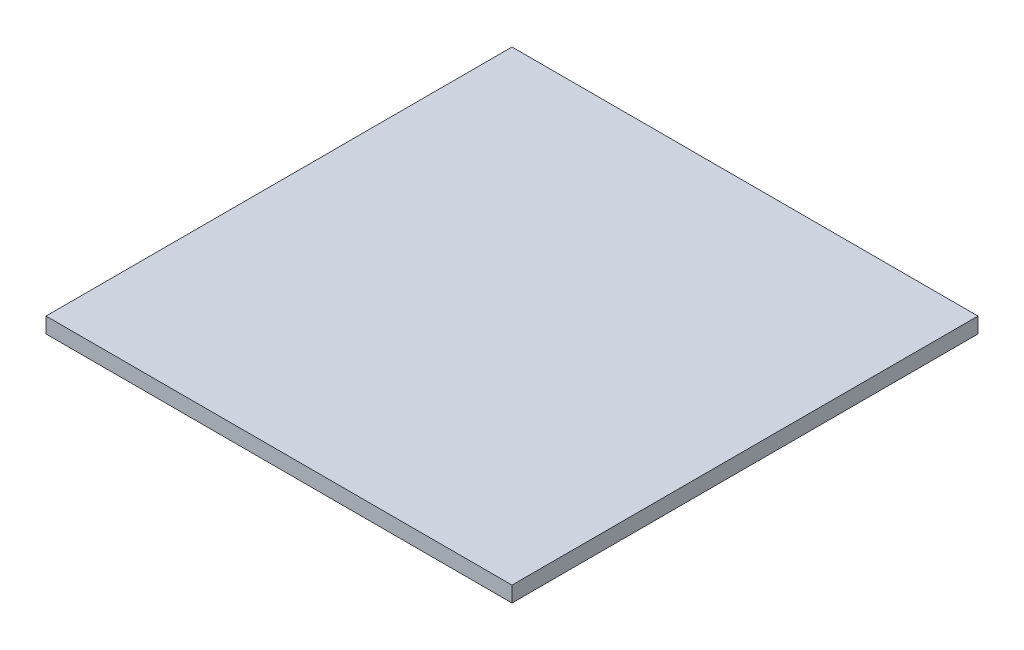
ISO-10303-21;
HEADER;
FILE_DESCRIPTION(('STEP AP214'),'2;1');
FILE_NAME('part.step','',(''),(''),'','','');
FILE_SCHEMA(('AUTOMOTIVE_DESIGN { 1 0 10303 214 1 1 1 1 }'));
ENDSEC;
DATA;
#1=APPLICATION_CONTEXT('core data for automotive mechanical design processes');
#2=APPLICATION_PROTOCOL_DEFINITION('international standard','automotive_design',2000,#1);
#3=PRODUCT_CONTEXT('',#1,'mechanical');
#4=PRODUCT('Part','Part','',(#3));
#5=PRODUCT_RELATED_PRODUCT_CATEGORY('part','',(#4));
#6=PRODUCT_DEFINITION_FORMATION('','',#4);
#7=PRODUCT_DEFINITION_CONTEXT('part definition',#1,'design');
#8=PRODUCT_DEFINITION('design','',#6,#7);
#9=PRODUCT_DEFINITION_SHAPE('','',#8);
#10=(LENGTH_UNIT() NAMED_UNIT(*) SI_UNIT(.MILLI.,.METRE.));
#11=(NAMED_UNIT(*) PLANE_ANGLE_UNIT() SI_UNIT($,.RADIAN.));
#12=(NAMED_UNIT(*) SI_UNIT($,.STERADIAN.) SOLID_ANGLE_UNIT());
#13=UNCERTAINTY_MEASURE_WITH_UNIT(LENGTH_MEASURE(1.E-05),#10,'distance_accuracy_value','');
#14=(GEOMETRIC_REPRESENTATION_CONTEXT(3) GLOBAL_UNCERTAINTY_ASSIGNED_CONTEXT((#13)) GLOBAL_UNIT_ASSIGNED_CONTEXT((#10,
#11,#12)) REPRESENTATION_CONTEXT('',''));
#15=CARTESIAN_POINT('',(0.,0.,0.));
#16=DIRECTION('',(0.,0.,1.));
#17=DIRECTION('',(1.,0.,0.));
#18=AXIS2_PLACEMENT_3D('',#15,#16,#17);
#19=CARTESIAN_POINT('',(761.999999999999,-25.4,762.));
#20=DIRECTION('',(-1.,0.,0.));
#21=DIRECTION('',(0.,0.,1.));
#22=AXIS2_PLACEMENT_3D('',#19,#20,#21);
#23=PLANE('',#22);
#24=DIRECTION('',(0.,1.,0.));
#25=VECTOR('',#24,1.);
#26=CARTESIAN_POINT('',(761.999999999999,-25.4,-762.));
#27=LINE('',#26,#25);
#28=CARTESIAN_POINT('',(761.999999999999,-25.4,-762.));
#29=VERTEX_POINT('',#28);
#30=CARTESIAN_POINT('',(761.999999999999,25.4,-762.));
#31=VERTEX_POINT('',#30);
#32=EDGE_CURVE('E96',#29,#31,#27,.T.);
#33=ORIENTED_EDGE('',*,*,#32,.T.);
#34=DIRECTION('',(0.,0.,-1.));
#35=VECTOR('',#34,1.);
#36=CARTESIAN_POINT('',(761.999999999999,25.4,762.));
#37=LINE('',#36,#35);
#38=CARTESIAN_POINT('',(761.999999999999,25.4,762.));
#39=VERTEX_POINT('',#38);
#40=EDGE_CURVE('E11',#39,#31,#37,.T.);
#41=ORIENTED_EDGE('',*,*,#40,.F.);
#42=DIRECTION('',(0.,1.,0.));
#43=VECTOR('',#42,1.);
#44=CARTESIAN_POINT('',(761.999999999999,-25.4,762.));
#45=LINE('',#44,#43);
#46=CARTESIAN_POINT('',(761.999999999999,-25.4,762.));
#47=VERTEX_POINT('',#46);
#48=EDGE_CURVE('E84',#47,#39,#45,.T.);
#49=ORIENTED_EDGE('',*,*,#48,.F.);
#50=DIRECTION('',(0.,0.,-1.));
#51=VECTOR('',#50,1.);
#52=CARTESIAN_POINT('',(761.999999999999,-25.4,762.));
#53=LINE('',#52,#51);
#54=EDGE_CURVE('E92',#47,#29,#53,.T.);
#55=ORIENTED_EDGE('',*,*,#54,.T.);
#56=EDGE_LOOP('',(#33,#41,#49,#55));
#57=FACE_BOUND('',#56,.T.);
#58=ADVANCED_FACE('F33',(#57),#23,.F.);
#59=CARTESIAN_POINT('',(-762.000000000001,25.4,762.));
#60=DIRECTION('',(0.,-1.,0.));
#61=DIRECTION('',(0.,0.,-1.));
#62=AXIS2_PLACEMENT_3D('',#59,#60,#61);
#63=PLANE('',#62);
#64=DIRECTION('',(-1.,0.,0.));
#65=VECTOR('',#64,1.);
#66=CARTESIAN_POINT('',(-762.000000000001,25.4,-762.));
#67=LINE('',#66,#65);
#68=CARTESIAN_POINT('',(-762.000000000001,25.4,-762.));
#69=VERTEX_POINT('',#68);
#70=EDGE_CURVE('E88',#31,#69,#67,.T.);
#71=ORIENTED_EDGE('',*,*,#70,.T.);
#72=DIRECTION('',(0.,0.,-1.));
#73=VECTOR('',#72,1.);
#74=CARTESIAN_POINT('',(-762.000000000001,25.4,762.));
#75=LINE('',#74,#73);
#76=CARTESIAN_POINT('',(-762.000000000001,25.4,762.));
#77=VERTEX_POINT('',#76);
#78=EDGE_CURVE('E41',#77,#69,#75,.T.);
#79=ORIENTED_EDGE('',*,*,#78,.F.);
#80=DIRECTION('',(-1.,0.,0.));
#81=VECTOR('',#80,1.);
#82=CARTESIAN_POINT('',(-762.000000000001,25.4,762.));
#83=LINE('',#82,#81);
#84=EDGE_CURVE('E79',#39,#77,#83,.T.);
#85=ORIENTED_EDGE('',*,*,#84,.F.);
#86=ORIENTED_EDGE('',*,*,#40,.T.);
#87=EDGE_LOOP('',(#71,#79,#85,#86));
#88=FACE_BOUND('',#87,.T.);
#89=ADVANCED_FACE('F87',(#88),#63,.F.);
#90=CARTESIAN_POINT('',(-762.000000000001,-25.4,762.));
#91=DIRECTION('',(1.,0.,0.));
#92=DIRECTION('',(0.,0.,-1.));
#93=AXIS2_PLACEMENT_3D('',#90,#91,#92);
#94=PLANE('',#93);
#95=DIRECTION('',(0.,-1.,0.));
#96=VECTOR('',#95,1.);
#97=CARTESIAN_POINT('',(-762.000000000001,-25.4,-762.));
#98=LINE('',#97,#96);
#99=CARTESIAN_POINT('',(-762.000000000001,-25.4,-762.));
#100=VERTEX_POINT('',#99);
#101=EDGE_CURVE('E66',#69,#100,#98,.T.);
#102=ORIENTED_EDGE('',*,*,#101,.T.);
#103=DIRECTION('',(0.,0.,-1.));
#104=VECTOR('',#103,1.);
#105=CARTESIAN_POINT('',(-762.000000000001,-25.4,762.));
#106=LINE('',#105,#104);
#107=CARTESIAN_POINT('',(-762.000000000001,-25.4,762.));
#108=VERTEX_POINT('',#107);
#109=EDGE_CURVE('E89',#108,#100,#106,.T.);
#110=ORIENTED_EDGE('',*,*,#109,.F.);
#111=DIRECTION('',(0.,-1.,0.));
#112=VECTOR('',#111,1.);
#113=CARTESIAN_POINT('',(-762.000000000001,-25.4,762.));
#114=LINE('',#113,#112);
#115=EDGE_CURVE('E82',#77,#108,#114,.T.);
#116=ORIENTED_EDGE('',*,*,#115,.F.);
#117=ORIENTED_EDGE('',*,*,#78,.T.);
#118=EDGE_LOOP('',(#102,#110,#116,#117));
#119=FACE_BOUND('',#118,.T.);
#120=ADVANCED_FACE('F90',(#119),#94,.F.);
#121=CARTESIAN_POINT('',(-762.000000000001,-25.4,762.));
#122=DIRECTION('',(0.,1.,0.));
#123=DIRECTION('',(0.,0.,1.));
#124=AXIS2_PLACEMENT_3D('',#121,#122,#123);
#125=PLANE('',#124);
#126=DIRECTION('',(1.,0.,0.));
#127=VECTOR('',#126,1.);
#128=CARTESIAN_POINT('',(-762.000000000001,-25.4,-762.));
#129=LINE('',#128,#127);
#130=EDGE_CURVE('E72',#100,#29,#129,.T.);
#131=ORIENTED_EDGE('',*,*,#130,.T.);
#132=ORIENTED_EDGE('',*,*,#54,.F.);
#133=DIRECTION('',(1.,0.,0.));
#134=VECTOR('',#133,1.);
#135=CARTESIAN_POINT('',(-762.000000000001,-25.4,762.));
#136=LINE('',#135,#134);
#137=EDGE_CURVE('E49',#108,#47,#136,.T.);
#138=ORIENTED_EDGE('',*,*,#137,.F.);
#139=ORIENTED_EDGE('',*,*,#109,.T.);
#140=EDGE_LOOP('',(#131,#132,#138,#139));
#141=FACE_BOUND('',#140,.T.);
#142=ADVANCED_FACE('F103',(#141),#125,.F.);
#143=CARTESIAN_POINT('',(0.,0.,762.));
#144=DIRECTION('',(0.,0.,-1.));
#145=DIRECTION('',(-1.,0.,0.));
#146=AXIS2_PLACEMENT_3D('',#143,#144,#145);
#147=PLANE('',#146);
#148=ORIENTED_EDGE('',*,*,#48,.T.);
#149=ORIENTED_EDGE('',*,*,#84,.T.);
#150=ORIENTED_EDGE('',*,*,#115,.T.);
#151=ORIENTED_EDGE('',*,*,#137,.T.);
#152=EDGE_LOOP('',(#148,#149,#150,#151));
#153=FACE_BOUND('',#152,.T.);
#154=ADVANCED_FACE('F80',(#153),#147,.F.);
#155=CARTESIAN_POINT('',(0.,0.,-762.));
#156=DIRECTION('',(0.,0.,-1.));
#157=DIRECTION('',(-1.,0.,0.));
#158=AXIS2_PLACEMENT_3D('',#155,#156,#157);
#159=PLANE('',#158);
#160=ORIENTED_EDGE('',*,*,#32,.F.);
#161=ORIENTED_EDGE('',*,*,#130,.F.);
#162=ORIENTED_EDGE('',*,*,#101,.F.);
#163=ORIENTED_EDGE('',*,*,#70,.F.);
#164=EDGE_LOOP('',(#160,#161,#162,#163));
#165=FACE_BOUND('',#164,.T.);
#166=ADVANCED_FACE('F106',(#165),#159,.T.);
#167=CLOSED_SHELL('',(#58,#89,#120,#142,#154,#166));
#168=MANIFOLD_SOLID_BREP('B2',#167);
#169=ADVANCED_BREP_SHAPE_REPRESENTATION('',(#18,#168),#14);
#170=SHAPE_DEFINITION_REPRESENTATION(#9,#169);
ENDSEC;
END-ISO-10303-21;
